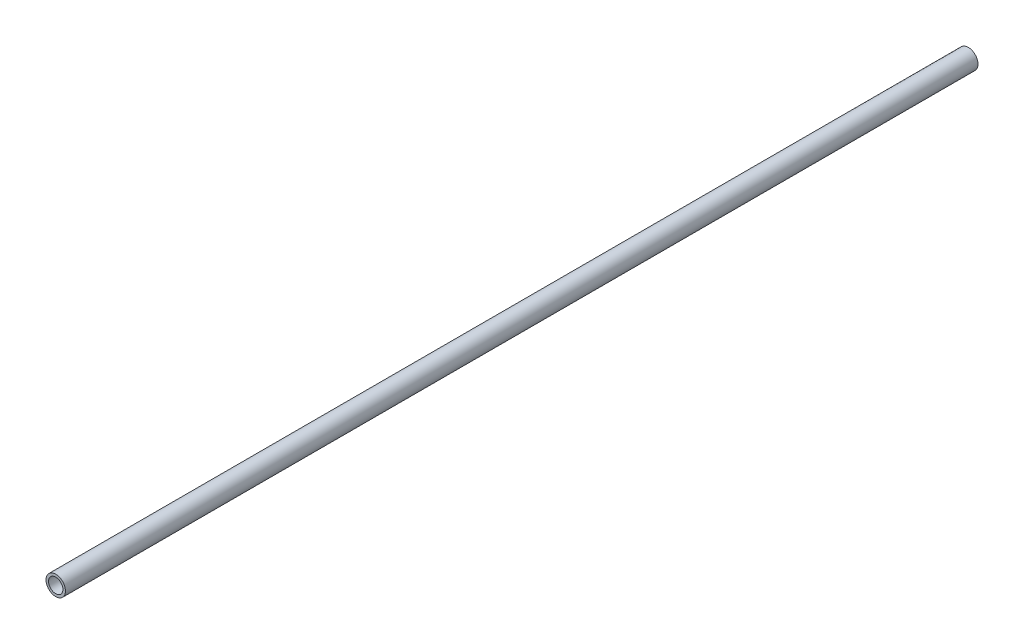
ISO-10303-21;
HEADER;
FILE_DESCRIPTION(('STEP AP214'),'2;1');
FILE_NAME('part.step','',(''),(''),'','','');
FILE_SCHEMA(('AUTOMOTIVE_DESIGN { 1 0 10303 214 1 1 1 1 }'));
ENDSEC;
DATA;
#1=APPLICATION_CONTEXT('core data for automotive mechanical design processes');
#2=APPLICATION_PROTOCOL_DEFINITION('international standard','automotive_design',2000,#1);
#3=PRODUCT_CONTEXT('',#1,'mechanical');
#4=PRODUCT('Part','Part','',(#3));
#5=PRODUCT_RELATED_PRODUCT_CATEGORY('part','',(#4));
#6=PRODUCT_DEFINITION_FORMATION('','',#4);
#7=PRODUCT_DEFINITION_CONTEXT('part definition',#1,'design');
#8=PRODUCT_DEFINITION('design','',#6,#7);
#9=PRODUCT_DEFINITION_SHAPE('','',#8);
#10=(LENGTH_UNIT() NAMED_UNIT(*) SI_UNIT(.MILLI.,.METRE.));
#11=(NAMED_UNIT(*) PLANE_ANGLE_UNIT() SI_UNIT($,.RADIAN.));
#12=(NAMED_UNIT(*) SI_UNIT($,.STERADIAN.) SOLID_ANGLE_UNIT());
#13=UNCERTAINTY_MEASURE_WITH_UNIT(LENGTH_MEASURE(1.E-05),#10,'distance_accuracy_value','');
#14=(GEOMETRIC_REPRESENTATION_CONTEXT(3) GLOBAL_UNCERTAINTY_ASSIGNED_CONTEXT((#13)) GLOBAL_UNIT_ASSIGNED_CONTEXT((#10,
#11,#12)) REPRESENTATION_CONTEXT('',''));
#15=CARTESIAN_POINT('',(0.,0.,0.));
#16=DIRECTION('',(0.,0.,1.));
#17=DIRECTION('',(1.,0.,0.));
#18=AXIS2_PLACEMENT_3D('',#15,#16,#17);
#19=CARTESIAN_POINT('',(0.,0.,500.));
#20=DIRECTION('',(0.,0.,1.));
#21=DIRECTION('',(1.,0.,0.));
#22=AXIS2_PLACEMENT_3D('',#19,#20,#21);
#23=PLANE('',#22);
#24=CARTESIAN_POINT('',(0.,0.,500.));
#25=DIRECTION('',(0.,0.,1.));
#26=DIRECTION('',(1.,0.,0.));
#27=AXIS2_PLACEMENT_3D('',#24,#25,#26);
#28=CIRCLE('',#27,10.668);
#29=CARTESIAN_POINT('',(10.668,0.,500.));
#30=VERTEX_POINT('',#29);
#31=EDGE_CURVE('E11',#30,#30,#28,.T.);
#32=ORIENTED_EDGE('',*,*,#31,.T.);
#33=EDGE_LOOP('',(#32));
#34=FACE_BOUND('',#33,.T.);
#35=CARTESIAN_POINT('',(0.,0.,500.));
#36=DIRECTION('',(0.,0.,1.));
#37=DIRECTION('',(1.,0.,0.));
#38=AXIS2_PLACEMENT_3D('',#35,#36,#37);
#39=CIRCLE('',#38,7.8994);
#40=CARTESIAN_POINT('',(7.8994,0.,500.));
#41=VERTEX_POINT('',#40);
#42=EDGE_CURVE('E56',#41,#41,#39,.T.);
#43=ORIENTED_EDGE('',*,*,#42,.F.);
#44=EDGE_LOOP('',(#43));
#45=FACE_BOUND('',#44,.T.);
#46=ADVANCED_FACE('F43',(#34,#45),#23,.T.);
#47=CARTESIAN_POINT('',(0.,0.,-500.));
#48=DIRECTION('',(0.,0.,1.));
#49=DIRECTION('',(1.,0.,0.));
#50=AXIS2_PLACEMENT_3D('',#47,#48,#49);
#51=PLANE('',#50);
#52=CARTESIAN_POINT('',(0.,0.,-500.));
#53=DIRECTION('',(0.,0.,1.));
#54=DIRECTION('',(1.,0.,0.));
#55=AXIS2_PLACEMENT_3D('',#52,#53,#54);
#56=CIRCLE('',#55,10.668);
#57=CARTESIAN_POINT('',(10.668,0.,-500.));
#58=VERTEX_POINT('',#57);
#59=EDGE_CURVE('E47',#58,#58,#56,.T.);
#60=ORIENTED_EDGE('',*,*,#59,.F.);
#61=EDGE_LOOP('',(#60));
#62=FACE_BOUND('',#61,.T.);
#63=CARTESIAN_POINT('',(0.,0.,-500.));
#64=DIRECTION('',(0.,0.,1.));
#65=DIRECTION('',(1.,0.,0.));
#66=AXIS2_PLACEMENT_3D('',#63,#64,#65);
#67=CIRCLE('',#66,7.8994);
#68=CARTESIAN_POINT('',(7.8994,0.,-500.));
#69=VERTEX_POINT('',#68);
#70=EDGE_CURVE('E58',#69,#69,#67,.T.);
#71=ORIENTED_EDGE('',*,*,#70,.T.);
#72=EDGE_LOOP('',(#71));
#73=FACE_BOUND('',#72,.T.);
#74=ADVANCED_FACE('F70',(#62,#73),#51,.F.);
#75=CARTESIAN_POINT('',(0.,0.,500.));
#76=DIRECTION('',(0.,0.,-1.));
#77=DIRECTION('',(-1.,0.,0.));
#78=AXIS2_PLACEMENT_3D('',#75,#76,#77);
#79=CYLINDRICAL_SURFACE('',#78,10.668);
#80=ORIENTED_EDGE('',*,*,#31,.F.);
#81=EDGE_LOOP('',(#80));
#82=FACE_BOUND('',#81,.T.);
#83=ORIENTED_EDGE('',*,*,#59,.T.);
#84=EDGE_LOOP('',(#83));
#85=FACE_BOUND('',#84,.T.);
#86=ADVANCED_FACE('F45',(#82,#85),#79,.T.);
#87=CARTESIAN_POINT('',(0.,0.,500.));
#88=DIRECTION('',(0.,0.,-1.));
#89=DIRECTION('',(-1.,0.,0.));
#90=AXIS2_PLACEMENT_3D('',#87,#88,#89);
#91=CYLINDRICAL_SURFACE('',#90,7.8994);
#92=ORIENTED_EDGE('',*,*,#42,.T.);
#93=EDGE_LOOP('',(#92));
#94=FACE_BOUND('',#93,.T.);
#95=ORIENTED_EDGE('',*,*,#70,.F.);
#96=EDGE_LOOP('',(#95));
#97=FACE_BOUND('',#96,.T.);
#98=ADVANCED_FACE('F66',(#94,#97),#91,.F.);
#99=CLOSED_SHELL('',(#46,#74,#86,#98));
#100=MANIFOLD_SOLID_BREP('B2',#99);
#101=ADVANCED_BREP_SHAPE_REPRESENTATION('',(#18,#100),#14);
#102=SHAPE_DEFINITION_REPRESENTATION(#9,#101);
ENDSEC;
END-ISO-10303-21;
